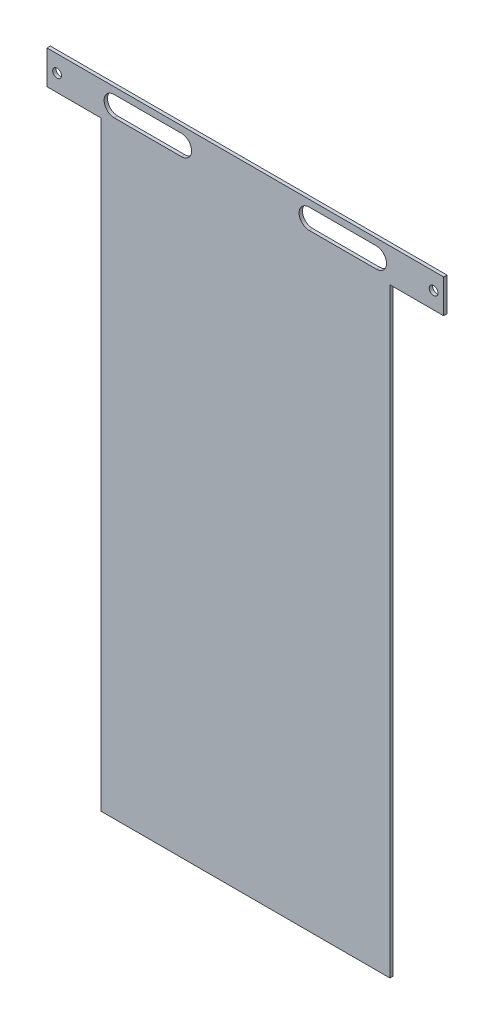
ISO-10303-21;
HEADER;
FILE_DESCRIPTION(('STEP AP214'),'2;1');
FILE_NAME('part.step','',(''),(''),'','','');
FILE_SCHEMA(('AUTOMOTIVE_DESIGN { 1 0 10303 214 1 1 1 1 }'));
ENDSEC;
DATA;
#1=APPLICATION_CONTEXT('core data for automotive mechanical design processes');
#2=APPLICATION_PROTOCOL_DEFINITION('international standard','automotive_design',2000,#1);
#3=PRODUCT_CONTEXT('',#1,'mechanical');
#4=PRODUCT('Part','Part','',(#3));
#5=PRODUCT_RELATED_PRODUCT_CATEGORY('part','',(#4));
#6=PRODUCT_DEFINITION_FORMATION('','',#4);
#7=PRODUCT_DEFINITION_CONTEXT('part definition',#1,'design');
#8=PRODUCT_DEFINITION('design','',#6,#7);
#9=PRODUCT_DEFINITION_SHAPE('','',#8);
#10=(LENGTH_UNIT() NAMED_UNIT(*) SI_UNIT(.MILLI.,.METRE.));
#11=(NAMED_UNIT(*) PLANE_ANGLE_UNIT() SI_UNIT($,.RADIAN.));
#12=(NAMED_UNIT(*) SI_UNIT($,.STERADIAN.) SOLID_ANGLE_UNIT());
#13=UNCERTAINTY_MEASURE_WITH_UNIT(LENGTH_MEASURE(1.E-05),#10,'distance_accuracy_value','');
#14=(GEOMETRIC_REPRESENTATION_CONTEXT(3) GLOBAL_UNCERTAINTY_ASSIGNED_CONTEXT((#13)) GLOBAL_UNIT_ASSIGNED_CONTEXT((#10,
#11,#12)) REPRESENTATION_CONTEXT('',''));
#15=CARTESIAN_POINT('',(0.,0.,0.));
#16=DIRECTION('',(0.,0.,1.));
#17=DIRECTION('',(1.,0.,0.));
#18=AXIS2_PLACEMENT_3D('',#15,#16,#17);
#19=CARTESIAN_POINT('',(-295.,0.,-5.));
#20=DIRECTION('',(-1.,0.,0.));
#21=DIRECTION('',(0.,-1.,0.));
#22=AXIS2_PLACEMENT_3D('',#19,#20,#21);
#23=PLANE('',#22);
#24=DIRECTION('',(0.,-1.,0.));
#25=VECTOR('',#24,1.);
#26=CARTESIAN_POINT('',(-295.,0.,0.));
#27=LINE('',#26,#25);
#28=CARTESIAN_POINT('',(-295.,0.,0.));
#29=VERTEX_POINT('',#28);
#30=CARTESIAN_POINT('',(-295.,-50.,0.));
#31=VERTEX_POINT('',#30);
#32=EDGE_CURVE('E232',#29,#31,#27,.T.);
#33=ORIENTED_EDGE('',*,*,#32,.F.);
#34=DIRECTION('',(0.,0.,1.));
#35=VECTOR('',#34,1.);
#36=CARTESIAN_POINT('',(-295.,0.,-5.));
#37=LINE('',#36,#35);
#38=CARTESIAN_POINT('',(-295.,0.,-5.));
#39=VERTEX_POINT('',#38);
#40=EDGE_CURVE('E11',#39,#29,#37,.T.);
#41=ORIENTED_EDGE('',*,*,#40,.F.);
#42=DIRECTION('',(0.,-1.,0.));
#43=VECTOR('',#42,1.);
#44=CARTESIAN_POINT('',(-295.,0.,-5.));
#45=LINE('',#44,#43);
#46=CARTESIAN_POINT('',(-295.,-50.,-5.));
#47=VERTEX_POINT('',#46);
#48=EDGE_CURVE('E241',#39,#47,#45,.T.);
#49=ORIENTED_EDGE('',*,*,#48,.T.);
#50=DIRECTION('',(0.,0.,1.));
#51=VECTOR('',#50,1.);
#52=CARTESIAN_POINT('',(-295.,-50.,-5.));
#53=LINE('',#52,#51);
#54=EDGE_CURVE('E48',#47,#31,#53,.T.);
#55=ORIENTED_EDGE('',*,*,#54,.T.);
#56=EDGE_LOOP('',(#33,#41,#49,#55));
#57=FACE_BOUND('',#56,.T.);
#58=ADVANCED_FACE('F45',(#57),#23,.T.);
#59=CARTESIAN_POINT('',(-295.,0.,-5.));
#60=DIRECTION('',(0.,1.,0.));
#61=DIRECTION('',(-1.,0.,0.));
#62=AXIS2_PLACEMENT_3D('',#59,#60,#61);
#63=PLANE('',#62);
#64=DIRECTION('',(-1.,0.,0.));
#65=VECTOR('',#64,1.);
#66=CARTESIAN_POINT('',(-295.,0.,0.));
#67=LINE('',#66,#65);
#68=CARTESIAN_POINT('',(295.,1.11022302462516E-13,0.));
#69=VERTEX_POINT('',#68);
#70=EDGE_CURVE('E245',#69,#29,#67,.T.);
#71=ORIENTED_EDGE('',*,*,#70,.F.);
#72=DIRECTION('',(0.,0.,1.));
#73=VECTOR('',#72,1.);
#74=CARTESIAN_POINT('',(295.,1.11022302462516E-13,-5.));
#75=LINE('',#74,#73);
#76=CARTESIAN_POINT('',(295.,1.11022302462516E-13,-5.));
#77=VERTEX_POINT('',#76);
#78=EDGE_CURVE('E53',#77,#69,#75,.T.);
#79=ORIENTED_EDGE('',*,*,#78,.F.);
#80=DIRECTION('',(-1.,0.,0.));
#81=VECTOR('',#80,1.);
#82=CARTESIAN_POINT('',(-295.,0.,-5.));
#83=LINE('',#82,#81);
#84=EDGE_CURVE('E263',#77,#39,#83,.T.);
#85=ORIENTED_EDGE('',*,*,#84,.T.);
#86=ORIENTED_EDGE('',*,*,#40,.T.);
#87=EDGE_LOOP('',(#71,#79,#85,#86));
#88=FACE_BOUND('',#87,.T.);
#89=ADVANCED_FACE('F310',(#88),#63,.T.);
#90=CARTESIAN_POINT('',(295.,1.11022302462516E-13,-5.));
#91=DIRECTION('',(1.,0.,0.));
#92=DIRECTION('',(0.,1.,0.));
#93=AXIS2_PLACEMENT_3D('',#90,#91,#92);
#94=PLANE('',#93);
#95=DIRECTION('',(0.,1.,0.));
#96=VECTOR('',#95,1.);
#97=CARTESIAN_POINT('',(295.,1.11022302462516E-13,0.));
#98=LINE('',#97,#96);
#99=CARTESIAN_POINT('',(295.,-49.9999999999999,0.));
#100=VERTEX_POINT('',#99);
#101=EDGE_CURVE('E283',#100,#69,#98,.T.);
#102=ORIENTED_EDGE('',*,*,#101,.F.);
#103=DIRECTION('',(0.,0.,1.));
#104=VECTOR('',#103,1.);
#105=CARTESIAN_POINT('',(295.,-49.9999999999999,-5.));
#106=LINE('',#105,#104);
#107=CARTESIAN_POINT('',(295.,-49.9999999999999,-5.));
#108=VERTEX_POINT('',#107);
#109=EDGE_CURVE('E289',#108,#100,#106,.T.);
#110=ORIENTED_EDGE('',*,*,#109,.F.);
#111=DIRECTION('',(0.,1.,0.));
#112=VECTOR('',#111,1.);
#113=CARTESIAN_POINT('',(295.,1.11022302462516E-13,-5.));
#114=LINE('',#113,#112);
#115=EDGE_CURVE('E260',#108,#77,#114,.T.);
#116=ORIENTED_EDGE('',*,*,#115,.T.);
#117=ORIENTED_EDGE('',*,*,#78,.T.);
#118=EDGE_LOOP('',(#102,#110,#116,#117));
#119=FACE_BOUND('',#118,.T.);
#120=ADVANCED_FACE('F330',(#119),#94,.T.);
#121=CARTESIAN_POINT('',(215.,-49.9999999999999,-5.));
#122=DIRECTION('',(0.,-1.,0.));
#123=DIRECTION('',(1.,0.,0.));
#124=AXIS2_PLACEMENT_3D('',#121,#122,#123);
#125=PLANE('',#124);
#126=DIRECTION('',(1.,0.,0.));
#127=VECTOR('',#126,1.);
#128=CARTESIAN_POINT('',(215.,-49.9999999999999,0.));
#129=LINE('',#128,#127);
#130=CARTESIAN_POINT('',(215.,-49.9999999999999,0.));
#131=VERTEX_POINT('',#130);
#132=EDGE_CURVE('E280',#131,#100,#129,.T.);
#133=ORIENTED_EDGE('',*,*,#132,.F.);
#134=DIRECTION('',(0.,0.,1.));
#135=VECTOR('',#134,1.);
#136=CARTESIAN_POINT('',(215.,-49.9999999999999,-5.));
#137=LINE('',#136,#135);
#138=CARTESIAN_POINT('',(215.,-49.9999999999999,-5.));
#139=VERTEX_POINT('',#138);
#140=EDGE_CURVE('E291',#139,#131,#137,.T.);
#141=ORIENTED_EDGE('',*,*,#140,.F.);
#142=DIRECTION('',(1.,0.,0.));
#143=VECTOR('',#142,1.);
#144=CARTESIAN_POINT('',(215.,-49.9999999999999,-5.));
#145=LINE('',#144,#143);
#146=EDGE_CURVE('E257',#139,#108,#145,.T.);
#147=ORIENTED_EDGE('',*,*,#146,.T.);
#148=ORIENTED_EDGE('',*,*,#109,.T.);
#149=EDGE_LOOP('',(#133,#141,#147,#148));
#150=FACE_BOUND('',#149,.T.);
#151=ADVANCED_FACE('F328',(#150),#125,.T.);
#152=CARTESIAN_POINT('',(215.,-49.9999999999999,-5.));
#153=DIRECTION('',(1.,0.,0.));
#154=DIRECTION('',(0.,1.,0.));
#155=AXIS2_PLACEMENT_3D('',#152,#153,#154);
#156=PLANE('',#155);
#157=DIRECTION('',(0.,1.,0.));
#158=VECTOR('',#157,1.);
#159=CARTESIAN_POINT('',(215.,-49.9999999999999,0.));
#160=LINE('',#159,#158);
#161=CARTESIAN_POINT('',(215.,-943.,0.));
#162=VERTEX_POINT('',#161);
#163=EDGE_CURVE('E277',#162,#131,#160,.T.);
#164=ORIENTED_EDGE('',*,*,#163,.F.);
#165=DIRECTION('',(0.,0.,1.));
#166=VECTOR('',#165,1.);
#167=CARTESIAN_POINT('',(215.,-943.,-5.));
#168=LINE('',#167,#166);
#169=CARTESIAN_POINT('',(215.,-943.,-5.));
#170=VERTEX_POINT('',#169);
#171=EDGE_CURVE('E293',#170,#162,#168,.T.);
#172=ORIENTED_EDGE('',*,*,#171,.F.);
#173=DIRECTION('',(0.,1.,0.));
#174=VECTOR('',#173,1.);
#175=CARTESIAN_POINT('',(215.,-49.9999999999999,-5.));
#176=LINE('',#175,#174);
#177=EDGE_CURVE('E254',#170,#139,#176,.T.);
#178=ORIENTED_EDGE('',*,*,#177,.T.);
#179=ORIENTED_EDGE('',*,*,#140,.T.);
#180=EDGE_LOOP('',(#164,#172,#178,#179));
#181=FACE_BOUND('',#180,.T.);
#182=ADVANCED_FACE('F324',(#181),#156,.T.);
#183=CARTESIAN_POINT('',(-215.,-943.,-5.));
#184=DIRECTION('',(0.,-1.,0.));
#185=DIRECTION('',(1.,0.,0.));
#186=AXIS2_PLACEMENT_3D('',#183,#184,#185);
#187=PLANE('',#186);
#188=DIRECTION('',(1.,0.,0.));
#189=VECTOR('',#188,1.);
#190=CARTESIAN_POINT('',(-215.,-943.,0.));
#191=LINE('',#190,#189);
#192=CARTESIAN_POINT('',(-215.,-943.,0.));
#193=VERTEX_POINT('',#192);
#194=EDGE_CURVE('E274',#193,#162,#191,.T.);
#195=ORIENTED_EDGE('',*,*,#194,.F.);
#196=DIRECTION('',(0.,0.,1.));
#197=VECTOR('',#196,1.);
#198=CARTESIAN_POINT('',(-215.,-943.,-5.));
#199=LINE('',#198,#197);
#200=CARTESIAN_POINT('',(-215.,-943.,-5.));
#201=VERTEX_POINT('',#200);
#202=EDGE_CURVE('E295',#201,#193,#199,.T.);
#203=ORIENTED_EDGE('',*,*,#202,.F.);
#204=DIRECTION('',(1.,0.,0.));
#205=VECTOR('',#204,1.);
#206=CARTESIAN_POINT('',(-215.,-943.,-5.));
#207=LINE('',#206,#205);
#208=EDGE_CURVE('E251',#201,#170,#207,.T.);
#209=ORIENTED_EDGE('',*,*,#208,.T.);
#210=ORIENTED_EDGE('',*,*,#171,.T.);
#211=EDGE_LOOP('',(#195,#203,#209,#210));
#212=FACE_BOUND('',#211,.T.);
#213=ADVANCED_FACE('F322',(#212),#187,.T.);
#214=CARTESIAN_POINT('',(-215.,-50.,-5.));
#215=DIRECTION('',(-1.,0.,0.));
#216=DIRECTION('',(0.,-1.,0.));
#217=AXIS2_PLACEMENT_3D('',#214,#215,#216);
#218=PLANE('',#217);
#219=DIRECTION('',(0.,-1.,0.));
#220=VECTOR('',#219,1.);
#221=CARTESIAN_POINT('',(-215.,-50.,0.));
#222=LINE('',#221,#220);
#223=CARTESIAN_POINT('',(-215.,-50.,0.));
#224=VERTEX_POINT('',#223);
#225=EDGE_CURVE('E271',#224,#193,#222,.T.);
#226=ORIENTED_EDGE('',*,*,#225,.F.);
#227=DIRECTION('',(0.,0.,1.));
#228=VECTOR('',#227,1.);
#229=CARTESIAN_POINT('',(-215.,-50.,-5.));
#230=LINE('',#229,#228);
#231=CARTESIAN_POINT('',(-215.,-50.,-5.));
#232=VERTEX_POINT('',#231);
#233=EDGE_CURVE('E296',#232,#224,#230,.T.);
#234=ORIENTED_EDGE('',*,*,#233,.F.);
#235=DIRECTION('',(0.,-1.,0.));
#236=VECTOR('',#235,1.);
#237=CARTESIAN_POINT('',(-215.,-50.,-5.));
#238=LINE('',#237,#236);
#239=EDGE_CURVE('E248',#232,#201,#238,.T.);
#240=ORIENTED_EDGE('',*,*,#239,.T.);
#241=ORIENTED_EDGE('',*,*,#202,.T.);
#242=EDGE_LOOP('',(#226,#234,#240,#241));
#243=FACE_BOUND('',#242,.T.);
#244=ADVANCED_FACE('F318',(#243),#218,.T.);
#245=CARTESIAN_POINT('',(-215.,-50.,-5.));
#246=DIRECTION('',(0.,-1.,0.));
#247=DIRECTION('',(0.,0.,-1.));
#248=AXIS2_PLACEMENT_3D('',#245,#246,#247);
#249=PLANE('',#248);
#250=DIRECTION('',(1.,0.,0.));
#251=VECTOR('',#250,1.);
#252=CARTESIAN_POINT('',(-215.,-50.,0.));
#253=LINE('',#252,#251);
#254=EDGE_CURVE('E268',#31,#224,#253,.T.);
#255=ORIENTED_EDGE('',*,*,#254,.F.);
#256=ORIENTED_EDGE('',*,*,#54,.F.);
#257=DIRECTION('',(1.,0.,0.));
#258=VECTOR('',#257,1.);
#259=CARTESIAN_POINT('',(-215.,-50.,-5.));
#260=LINE('',#259,#258);
#261=EDGE_CURVE('E244',#47,#232,#260,.T.);
#262=ORIENTED_EDGE('',*,*,#261,.T.);
#263=ORIENTED_EDGE('',*,*,#233,.T.);
#264=EDGE_LOOP('',(#255,#256,#262,#263));
#265=FACE_BOUND('',#264,.T.);
#266=ADVANCED_FACE('F304',(#265),#249,.T.);
#267=CARTESIAN_POINT('',(0.,0.,-5.));
#268=DIRECTION('',(0.,0.,-1.));
#269=DIRECTION('',(-1.,0.,0.));
#270=AXIS2_PLACEMENT_3D('',#267,#268,#269);
#271=PLANE('',#270);
#272=CARTESIAN_POINT('',(195.,-25.,-5.));
#273=DIRECTION('',(0.,0.,1.));
#274=DIRECTION('',(1.,0.,0.));
#275=AXIS2_PLACEMENT_3D('',#272,#273,#274);
#276=CIRCLE('',#275,15.);
#277=CARTESIAN_POINT('',(195.,-40.,-5.));
#278=VERTEX_POINT('',#277);
#279=CARTESIAN_POINT('',(195.,-10.,-5.));
#280=VERTEX_POINT('',#279);
#281=EDGE_CURVE('E162',#278,#280,#276,.T.);
#282=ORIENTED_EDGE('',*,*,#281,.T.);
#283=DIRECTION('',(-1.,0.,0.));
#284=VECTOR('',#283,1.);
#285=CARTESIAN_POINT('',(195.,-10.,-5.));
#286=LINE('',#285,#284);
#287=CARTESIAN_POINT('',(95.0000000000002,-10.,-5.));
#288=VERTEX_POINT('',#287);
#289=EDGE_CURVE('E173',#280,#288,#286,.T.);
#290=ORIENTED_EDGE('',*,*,#289,.T.);
#291=CARTESIAN_POINT('',(95.0000000000002,-25.,-5.));
#292=DIRECTION('',(0.,0.,1.));
#293=DIRECTION('',(1.,0.,0.));
#294=AXIS2_PLACEMENT_3D('',#291,#292,#293);
#295=CIRCLE('',#294,15.);
#296=CARTESIAN_POINT('',(95.0000000000002,-40.,-5.));
#297=VERTEX_POINT('',#296);
#298=EDGE_CURVE('E61',#288,#297,#295,.T.);
#299=ORIENTED_EDGE('',*,*,#298,.T.);
#300=DIRECTION('',(1.,0.,0.));
#301=VECTOR('',#300,1.);
#302=CARTESIAN_POINT('',(195.,-40.,-5.));
#303=LINE('',#302,#301);
#304=EDGE_CURVE('E170',#297,#278,#303,.T.);
#305=ORIENTED_EDGE('',*,*,#304,.T.);
#306=EDGE_LOOP('',(#282,#290,#299,#305));
#307=FACE_BOUND('',#306,.T.);
#308=CARTESIAN_POINT('',(-195.,-25.0000000000001,-5.));
#309=DIRECTION('',(0.,0.,1.));
#310=DIRECTION('',(-1.,0.,0.));
#311=AXIS2_PLACEMENT_3D('',#308,#309,#310);
#312=CIRCLE('',#311,15.);
#313=CARTESIAN_POINT('',(-195.,-10.0000000000001,-5.));
#314=VERTEX_POINT('',#313);
#315=CARTESIAN_POINT('',(-195.,-40.0000000000001,-5.));
#316=VERTEX_POINT('',#315);
#317=EDGE_CURVE('E200',#314,#316,#312,.T.);
#318=ORIENTED_EDGE('',*,*,#317,.T.);
#319=DIRECTION('',(1.,0.,0.));
#320=VECTOR('',#319,1.);
#321=CARTESIAN_POINT('',(-195.,-40.0000000000001,-5.));
#322=LINE('',#321,#320);
#323=CARTESIAN_POINT('',(-95.0000000000002,-40.0000000000001,-5.));
#324=VERTEX_POINT('',#323);
#325=EDGE_CURVE('E203',#316,#324,#322,.T.);
#326=ORIENTED_EDGE('',*,*,#325,.T.);
#327=CARTESIAN_POINT('',(-95.0000000000002,-25.0000000000001,-5.));
#328=DIRECTION('',(0.,0.,1.));
#329=DIRECTION('',(-1.,0.,0.));
#330=AXIS2_PLACEMENT_3D('',#327,#328,#329);
#331=CIRCLE('',#330,15.);
#332=CARTESIAN_POINT('',(-95.0000000000002,-10.0000000000001,-5.));
#333=VERTEX_POINT('',#332);
#334=EDGE_CURVE('E69',#324,#333,#331,.T.);
#335=ORIENTED_EDGE('',*,*,#334,.T.);
#336=DIRECTION('',(-1.,0.,0.));
#337=VECTOR('',#336,1.);
#338=CARTESIAN_POINT('',(-195.,-10.0000000000001,-5.));
#339=LINE('',#338,#337);
#340=EDGE_CURVE('E208',#333,#314,#339,.T.);
#341=ORIENTED_EDGE('',*,*,#340,.T.);
#342=EDGE_LOOP('',(#318,#326,#335,#341));
#343=FACE_BOUND('',#342,.T.);
#344=CARTESIAN_POINT('',(280.,-24.9999999999999,-5.));
#345=DIRECTION('',(0.,0.,1.));
#346=DIRECTION('',(1.,0.,0.));
#347=AXIS2_PLACEMENT_3D('',#344,#345,#346);
#348=CIRCLE('',#347,6.4999999999999);
#349=CARTESIAN_POINT('',(286.5,-24.9999999999999,-5.));
#350=VERTEX_POINT('',#349);
#351=EDGE_CURVE('E229',#350,#350,#348,.T.);
#352=ORIENTED_EDGE('',*,*,#351,.T.);
#353=EDGE_LOOP('',(#352));
#354=FACE_BOUND('',#353,.T.);
#355=CARTESIAN_POINT('',(-280.,-25.,-5.));
#356=DIRECTION('',(0.,0.,1.));
#357=DIRECTION('',(1.,0.,0.));
#358=AXIS2_PLACEMENT_3D('',#355,#356,#357);
#359=CIRCLE('',#358,6.50000000000002);
#360=CARTESIAN_POINT('',(-273.5,-25.,-5.));
#361=VERTEX_POINT('',#360);
#362=EDGE_CURVE('E236',#361,#361,#359,.T.);
#363=ORIENTED_EDGE('',*,*,#362,.T.);
#364=EDGE_LOOP('',(#363));
#365=FACE_BOUND('',#364,.T.);
#366=ORIENTED_EDGE('',*,*,#48,.F.);
#367=ORIENTED_EDGE('',*,*,#84,.F.);
#368=ORIENTED_EDGE('',*,*,#115,.F.);
#369=ORIENTED_EDGE('',*,*,#146,.F.);
#370=ORIENTED_EDGE('',*,*,#177,.F.);
#371=ORIENTED_EDGE('',*,*,#208,.F.);
#372=ORIENTED_EDGE('',*,*,#239,.F.);
#373=ORIENTED_EDGE('',*,*,#261,.F.);
#374=EDGE_LOOP('',(#366,#367,#368,#369,#370,#371,#372,#373));
#375=FACE_BOUND('',#374,.T.);
#376=ADVANCED_FACE('F177',(#307,#343,#354,#365,#375),#271,.T.);
#377=CARTESIAN_POINT('',(0.,0.,0.));
#378=DIRECTION('',(0.,0.,-1.));
#379=DIRECTION('',(-1.,0.,0.));
#380=AXIS2_PLACEMENT_3D('',#377,#378,#379);
#381=PLANE('',#380);
#382=DIRECTION('',(-1.,0.,0.));
#383=VECTOR('',#382,1.);
#384=CARTESIAN_POINT('',(195.,-10.,0.));
#385=LINE('',#384,#383);
#386=CARTESIAN_POINT('',(195.,-10.,0.));
#387=VERTEX_POINT('',#386);
#388=CARTESIAN_POINT('',(95.0000000000002,-10.,0.));
#389=VERTEX_POINT('',#388);
#390=EDGE_CURVE('E189',#387,#389,#385,.T.);
#391=ORIENTED_EDGE('',*,*,#390,.F.);
#392=CARTESIAN_POINT('',(195.,-25.,0.));
#393=DIRECTION('',(0.,0.,1.));
#394=DIRECTION('',(1.,0.,0.));
#395=AXIS2_PLACEMENT_3D('',#392,#393,#394);
#396=CIRCLE('',#395,15.);
#397=CARTESIAN_POINT('',(195.,-40.,0.));
#398=VERTEX_POINT('',#397);
#399=EDGE_CURVE('E165',#398,#387,#396,.T.);
#400=ORIENTED_EDGE('',*,*,#399,.F.);
#401=DIRECTION('',(1.,0.,0.));
#402=VECTOR('',#401,1.);
#403=CARTESIAN_POINT('',(195.,-40.,0.));
#404=LINE('',#403,#402);
#405=CARTESIAN_POINT('',(95.0000000000002,-40.,0.));
#406=VERTEX_POINT('',#405);
#407=EDGE_CURVE('E180',#406,#398,#404,.T.);
#408=ORIENTED_EDGE('',*,*,#407,.F.);
#409=CARTESIAN_POINT('',(95.0000000000002,-25.,0.));
#410=DIRECTION('',(0.,0.,1.));
#411=DIRECTION('',(1.,0.,0.));
#412=AXIS2_PLACEMENT_3D('',#409,#410,#411);
#413=CIRCLE('',#412,15.);
#414=EDGE_CURVE('E183',#389,#406,#413,.T.);
#415=ORIENTED_EDGE('',*,*,#414,.F.);
#416=EDGE_LOOP('',(#391,#400,#408,#415));
#417=FACE_BOUND('',#416,.T.);
#418=DIRECTION('',(1.,0.,0.));
#419=VECTOR('',#418,1.);
#420=CARTESIAN_POINT('',(-195.,-40.0000000000001,0.));
#421=LINE('',#420,#419);
#422=CARTESIAN_POINT('',(-195.,-40.0000000000001,0.));
#423=VERTEX_POINT('',#422);
#424=CARTESIAN_POINT('',(-95.0000000000002,-40.0000000000001,0.));
#425=VERTEX_POINT('',#424);
#426=EDGE_CURVE('E214',#423,#425,#421,.T.);
#427=ORIENTED_EDGE('',*,*,#426,.F.);
#428=CARTESIAN_POINT('',(-195.,-25.0000000000001,0.));
#429=DIRECTION('',(0.,0.,1.));
#430=DIRECTION('',(-1.,0.,0.));
#431=AXIS2_PLACEMENT_3D('',#428,#429,#430);
#432=CIRCLE('',#431,15.);
#433=CARTESIAN_POINT('',(-195.,-10.0000000000001,0.));
#434=VERTEX_POINT('',#433);
#435=EDGE_CURVE('E212',#434,#423,#432,.T.);
#436=ORIENTED_EDGE('',*,*,#435,.F.);
#437=DIRECTION('',(-1.,0.,0.));
#438=VECTOR('',#437,1.);
#439=CARTESIAN_POINT('',(-195.,-10.0000000000001,0.));
#440=LINE('',#439,#438);
#441=CARTESIAN_POINT('',(-95.0000000000002,-10.0000000000001,0.));
#442=VERTEX_POINT('',#441);
#443=EDGE_CURVE('E204',#442,#434,#440,.T.);
#444=ORIENTED_EDGE('',*,*,#443,.F.);
#445=CARTESIAN_POINT('',(-95.0000000000002,-25.0000000000001,0.));
#446=DIRECTION('',(0.,0.,1.));
#447=DIRECTION('',(-1.,0.,0.));
#448=AXIS2_PLACEMENT_3D('',#445,#446,#447);
#449=CIRCLE('',#448,15.);
#450=EDGE_CURVE('E217',#425,#442,#449,.T.);
#451=ORIENTED_EDGE('',*,*,#450,.F.);
#452=EDGE_LOOP('',(#427,#436,#444,#451));
#453=FACE_BOUND('',#452,.T.);
#454=CARTESIAN_POINT('',(280.,-24.9999999999999,0.));
#455=DIRECTION('',(0.,0.,1.));
#456=DIRECTION('',(1.,0.,0.));
#457=AXIS2_PLACEMENT_3D('',#454,#455,#456);
#458=CIRCLE('',#457,6.4999999999999);
#459=CARTESIAN_POINT('',(286.5,-24.9999999999999,0.));
#460=VERTEX_POINT('',#459);
#461=EDGE_CURVE('E233',#460,#460,#458,.T.);
#462=ORIENTED_EDGE('',*,*,#461,.F.);
#463=EDGE_LOOP('',(#462));
#464=FACE_BOUND('',#463,.T.);
#465=CARTESIAN_POINT('',(-280.,-25.,0.));
#466=DIRECTION('',(0.,0.,1.));
#467=DIRECTION('',(1.,0.,0.));
#468=AXIS2_PLACEMENT_3D('',#465,#466,#467);
#469=CIRCLE('',#468,6.50000000000002);
#470=CARTESIAN_POINT('',(-273.5,-25.,0.));
#471=VERTEX_POINT('',#470);
#472=EDGE_CURVE('E196',#471,#471,#469,.T.);
#473=ORIENTED_EDGE('',*,*,#472,.F.);
#474=EDGE_LOOP('',(#473));
#475=FACE_BOUND('',#474,.T.);
#476=ORIENTED_EDGE('',*,*,#32,.T.);
#477=ORIENTED_EDGE('',*,*,#254,.T.);
#478=ORIENTED_EDGE('',*,*,#225,.T.);
#479=ORIENTED_EDGE('',*,*,#194,.T.);
#480=ORIENTED_EDGE('',*,*,#163,.T.);
#481=ORIENTED_EDGE('',*,*,#132,.T.);
#482=ORIENTED_EDGE('',*,*,#101,.T.);
#483=ORIENTED_EDGE('',*,*,#70,.T.);
#484=EDGE_LOOP('',(#476,#477,#478,#479,#480,#481,#482,#483));
#485=FACE_BOUND('',#484,.T.);
#486=ADVANCED_FACE('F306',(#417,#453,#464,#475,#485),#381,.F.);
#487=CARTESIAN_POINT('',(-280.,-25.,-5.));
#488=DIRECTION('',(0.,0.,1.));
#489=DIRECTION('',(1.,0.,0.));
#490=AXIS2_PLACEMENT_3D('',#487,#488,#489);
#491=CYLINDRICAL_SURFACE('',#490,6.50000000000002);
#492=ORIENTED_EDGE('',*,*,#362,.F.);
#493=EDGE_LOOP('',(#492));
#494=FACE_BOUND('',#493,.T.);
#495=ORIENTED_EDGE('',*,*,#472,.T.);
#496=EDGE_LOOP('',(#495));
#497=FACE_BOUND('',#496,.T.);
#498=ADVANCED_FACE('F416',(#494,#497),#491,.F.);
#499=CARTESIAN_POINT('',(280.,-24.9999999999999,-5.));
#500=DIRECTION('',(0.,0.,1.));
#501=DIRECTION('',(1.,0.,0.));
#502=AXIS2_PLACEMENT_3D('',#499,#500,#501);
#503=CYLINDRICAL_SURFACE('',#502,6.4999999999999);
#504=ORIENTED_EDGE('',*,*,#351,.F.);
#505=EDGE_LOOP('',(#504));
#506=FACE_BOUND('',#505,.T.);
#507=ORIENTED_EDGE('',*,*,#461,.T.);
#508=EDGE_LOOP('',(#507));
#509=FACE_BOUND('',#508,.T.);
#510=ADVANCED_FACE('F427',(#506,#509),#503,.F.);
#511=CARTESIAN_POINT('',(-195.,-25.0000000000001,-5.));
#512=DIRECTION('',(0.,0.,1.));
#513=DIRECTION('',(1.,0.,0.));
#514=AXIS2_PLACEMENT_3D('',#511,#512,#513);
#515=CYLINDRICAL_SURFACE('',#514,15.);
#516=ORIENTED_EDGE('',*,*,#435,.T.);
#517=DIRECTION('',(0.,0.,1.));
#518=VECTOR('',#517,1.);
#519=CARTESIAN_POINT('',(-195.,-40.0000000000001,-5.));
#520=LINE('',#519,#518);
#521=EDGE_CURVE('E211',#316,#423,#520,.T.);
#522=ORIENTED_EDGE('',*,*,#521,.F.);
#523=ORIENTED_EDGE('',*,*,#317,.F.);
#524=DIRECTION('',(0.,0.,1.));
#525=VECTOR('',#524,1.);
#526=CARTESIAN_POINT('',(-195.,-10.0000000000001,-5.));
#527=LINE('',#526,#525);
#528=EDGE_CURVE('E190',#314,#434,#527,.T.);
#529=ORIENTED_EDGE('',*,*,#528,.T.);
#530=EDGE_LOOP('',(#516,#522,#523,#529));
#531=FACE_BOUND('',#530,.T.);
#532=ADVANCED_FACE('F437',(#531),#515,.F.);
#533=CARTESIAN_POINT('',(-195.,-10.0000000000001,-5.));
#534=DIRECTION('',(0.,1.,0.));
#535=DIRECTION('',(0.,0.,1.));
#536=AXIS2_PLACEMENT_3D('',#533,#534,#535);
#537=PLANE('',#536);
#538=ORIENTED_EDGE('',*,*,#443,.T.);
#539=ORIENTED_EDGE('',*,*,#528,.F.);
#540=ORIENTED_EDGE('',*,*,#340,.F.);
#541=DIRECTION('',(0.,0.,1.));
#542=VECTOR('',#541,1.);
#543=CARTESIAN_POINT('',(-95.0000000000002,-10.0000000000001,-5.));
#544=LINE('',#543,#542);
#545=EDGE_CURVE('E223',#333,#442,#544,.T.);
#546=ORIENTED_EDGE('',*,*,#545,.T.);
#547=EDGE_LOOP('',(#538,#539,#540,#546));
#548=FACE_BOUND('',#547,.T.);
#549=ADVANCED_FACE('F447',(#548),#537,.F.);
#550=CARTESIAN_POINT('',(-95.0000000000002,-25.0000000000001,-5.));
#551=DIRECTION('',(0.,0.,1.));
#552=DIRECTION('',(1.,0.,0.));
#553=AXIS2_PLACEMENT_3D('',#550,#551,#552);
#554=CYLINDRICAL_SURFACE('',#553,15.);
#555=ORIENTED_EDGE('',*,*,#450,.T.);
#556=ORIENTED_EDGE('',*,*,#545,.F.);
#557=ORIENTED_EDGE('',*,*,#334,.F.);
#558=DIRECTION('',(0.,0.,1.));
#559=VECTOR('',#558,1.);
#560=CARTESIAN_POINT('',(-95.0000000000002,-40.0000000000001,-5.));
#561=LINE('',#560,#559);
#562=EDGE_CURVE('E225',#324,#425,#561,.T.);
#563=ORIENTED_EDGE('',*,*,#562,.T.);
#564=EDGE_LOOP('',(#555,#556,#557,#563));
#565=FACE_BOUND('',#564,.T.);
#566=ADVANCED_FACE('F458',(#565),#554,.F.);
#567=CARTESIAN_POINT('',(-195.,-40.0000000000001,-5.));
#568=DIRECTION('',(0.,-1.,0.));
#569=DIRECTION('',(0.,0.,-1.));
#570=AXIS2_PLACEMENT_3D('',#567,#568,#569);
#571=PLANE('',#570);
#572=ORIENTED_EDGE('',*,*,#426,.T.);
#573=ORIENTED_EDGE('',*,*,#562,.F.);
#574=ORIENTED_EDGE('',*,*,#325,.F.);
#575=ORIENTED_EDGE('',*,*,#521,.T.);
#576=EDGE_LOOP('',(#572,#573,#574,#575));
#577=FACE_BOUND('',#576,.T.);
#578=ADVANCED_FACE('F469',(#577),#571,.F.);
#579=CARTESIAN_POINT('',(195.,-25.,-5.));
#580=DIRECTION('',(0.,0.,1.));
#581=DIRECTION('',(1.,0.,0.));
#582=AXIS2_PLACEMENT_3D('',#579,#580,#581);
#583=CYLINDRICAL_SURFACE('',#582,15.);
#584=ORIENTED_EDGE('',*,*,#399,.T.);
#585=DIRECTION('',(0.,0.,1.));
#586=VECTOR('',#585,1.);
#587=CARTESIAN_POINT('',(195.,-10.,-5.));
#588=LINE('',#587,#586);
#589=EDGE_CURVE('E158',#280,#387,#588,.T.);
#590=ORIENTED_EDGE('',*,*,#589,.F.);
#591=ORIENTED_EDGE('',*,*,#281,.F.);
#592=DIRECTION('',(0.,0.,1.));
#593=VECTOR('',#592,1.);
#594=CARTESIAN_POINT('',(195.,-40.,-5.));
#595=LINE('',#594,#593);
#596=EDGE_CURVE('E194',#278,#398,#595,.T.);
#597=ORIENTED_EDGE('',*,*,#596,.T.);
#598=EDGE_LOOP('',(#584,#590,#591,#597));
#599=FACE_BOUND('',#598,.T.);
#600=ADVANCED_FACE('F160',(#599),#583,.F.);
#601=CARTESIAN_POINT('',(195.,-40.,-5.));
#602=DIRECTION('',(0.,-1.,0.));
#603=DIRECTION('',(1.,0.,0.));
#604=AXIS2_PLACEMENT_3D('',#601,#602,#603);
#605=PLANE('',#604);
#606=ORIENTED_EDGE('',*,*,#407,.T.);
#607=ORIENTED_EDGE('',*,*,#596,.F.);
#608=ORIENTED_EDGE('',*,*,#304,.F.);
#609=DIRECTION('',(0.,0.,1.));
#610=VECTOR('',#609,1.);
#611=CARTESIAN_POINT('',(95.0000000000002,-40.,-5.));
#612=LINE('',#611,#610);
#613=EDGE_CURVE('E197',#297,#406,#612,.T.);
#614=ORIENTED_EDGE('',*,*,#613,.T.);
#615=EDGE_LOOP('',(#606,#607,#608,#614));
#616=FACE_BOUND('',#615,.T.);
#617=ADVANCED_FACE('F489',(#616),#605,.F.);
#618=CARTESIAN_POINT('',(95.0000000000002,-25.,-5.));
#619=DIRECTION('',(0.,0.,1.));
#620=DIRECTION('',(1.,0.,0.));
#621=AXIS2_PLACEMENT_3D('',#618,#619,#620);
#622=CYLINDRICAL_SURFACE('',#621,15.);
#623=ORIENTED_EDGE('',*,*,#414,.T.);
#624=ORIENTED_EDGE('',*,*,#613,.F.);
#625=ORIENTED_EDGE('',*,*,#298,.F.);
#626=DIRECTION('',(0.,0.,1.));
#627=VECTOR('',#626,1.);
#628=CARTESIAN_POINT('',(95.0000000000002,-10.,-5.));
#629=LINE('',#628,#627);
#630=EDGE_CURVE('E169',#288,#389,#629,.T.);
#631=ORIENTED_EDGE('',*,*,#630,.T.);
#632=EDGE_LOOP('',(#623,#624,#625,#631));
#633=FACE_BOUND('',#632,.T.);
#634=ADVANCED_FACE('F499',(#633),#622,.F.);
#635=CARTESIAN_POINT('',(195.,-10.,-5.));
#636=DIRECTION('',(0.,1.,0.));
#637=DIRECTION('',(-1.,0.,0.));
#638=AXIS2_PLACEMENT_3D('',#635,#636,#637);
#639=PLANE('',#638);
#640=ORIENTED_EDGE('',*,*,#390,.T.);
#641=ORIENTED_EDGE('',*,*,#630,.F.);
#642=ORIENTED_EDGE('',*,*,#289,.F.);
#643=ORIENTED_EDGE('',*,*,#589,.T.);
#644=EDGE_LOOP('',(#640,#641,#642,#643));
#645=FACE_BOUND('',#644,.T.);
#646=ADVANCED_FACE('F174',(#645),#639,.F.);
#647=CLOSED_SHELL('',(#58,#89,#120,#151,#182,#213,#244,#266,#376,#486,#498,#510,#532,#549,#566,
#578,#600,#617,#634,#646));
#648=MANIFOLD_SOLID_BREP('B2',#647);
#649=ADVANCED_BREP_SHAPE_REPRESENTATION('',(#18,#648),#14);
#650=SHAPE_DEFINITION_REPRESENTATION(#9,#649);
ENDSEC;
END-ISO-10303-21;
